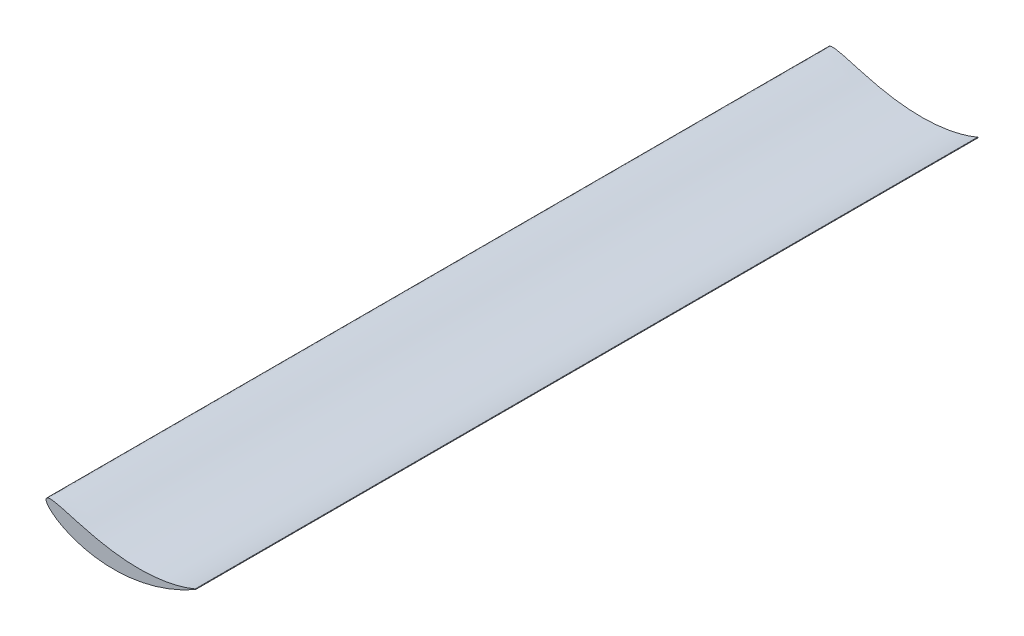
ISO-10303-21;
HEADER;
FILE_DESCRIPTION(('STEP AP214'),'2;1');
FILE_NAME('part.step','',(''),(''),'','','');
FILE_SCHEMA(('AUTOMOTIVE_DESIGN { 1 0 10303 214 1 1 1 1 }'));
ENDSEC;
DATA;
#1=APPLICATION_CONTEXT('core data for automotive mechanical design processes');
#2=APPLICATION_PROTOCOL_DEFINITION('international standard','automotive_design',2000,#1);
#3=PRODUCT_CONTEXT('',#1,'mechanical');
#4=PRODUCT('Part','Part','',(#3));
#5=PRODUCT_RELATED_PRODUCT_CATEGORY('part','',(#4));
#6=PRODUCT_DEFINITION_FORMATION('','',#4);
#7=PRODUCT_DEFINITION_CONTEXT('part definition',#1,'design');
#8=PRODUCT_DEFINITION('design','',#6,#7);
#9=PRODUCT_DEFINITION_SHAPE('','',#8);
#10=(LENGTH_UNIT() NAMED_UNIT(*) SI_UNIT(.MILLI.,.METRE.));
#11=(NAMED_UNIT(*) PLANE_ANGLE_UNIT() SI_UNIT($,.RADIAN.));
#12=(NAMED_UNIT(*) SI_UNIT($,.STERADIAN.) SOLID_ANGLE_UNIT());
#13=UNCERTAINTY_MEASURE_WITH_UNIT(LENGTH_MEASURE(1.E-05),#10,'distance_accuracy_value','');
#14=(GEOMETRIC_REPRESENTATION_CONTEXT(3) GLOBAL_UNCERTAINTY_ASSIGNED_CONTEXT((#13)) GLOBAL_UNIT_ASSIGNED_CONTEXT((#10,
#11,#12)) REPRESENTATION_CONTEXT('',''));
#15=CARTESIAN_POINT('',(0.,0.,0.));
#16=DIRECTION('',(0.,0.,1.));
#17=DIRECTION('',(1.,0.,0.));
#18=AXIS2_PLACEMENT_3D('',#15,#16,#17);
#19=CARTESIAN_POINT('',(190.956241572749,-4.7773652400738,500.));
#20=CARTESIAN_POINT('',(190.824351331435,-4.85073465637911,500.));
#21=CARTESIAN_POINT('',(189.266236246989,-5.71631154867927,500.));
#22=CARTESIAN_POINT('',(186.010858372446,-7.49360526460153,500.));
#23=CARTESIAN_POINT('',(180.823647875429,-10.2147269313576,500.));
#24=CARTESIAN_POINT('',(174.698235283672,-13.2560143177396,500.));
#25=CARTESIAN_POINT('',(167.59135908908,-16.5395762823449,500.));
#26=CARTESIAN_POINT('',(159.48834975273,-19.9547276540953,500.));
#27=CARTESIAN_POINT('',(150.393963734915,-23.3650509430077,500.));
#28=CARTESIAN_POINT('',(140.348546412923,-26.6128977934457,500.));
#29=CARTESIAN_POINT('',(129.433550223174,-29.5248982498167,500.));
#30=CARTESIAN_POINT('',(117.779572076668,-31.9239998784419,500.));
#31=CARTESIAN_POINT('',(105.569465285836,-33.648313549697,500.));
#32=CARTESIAN_POINT('',(93.0340059448322,-34.5635604701211,500.));
#33=CARTESIAN_POINT('',(80.4426492143391,-34.5850966651918,500.));
#34=CARTESIAN_POINT('',(68.0856866427688,-33.6870014790861,500.));
#35=CARTESIAN_POINT('',(56.2532972721014,-31.9099389515743,500.));
#36=CARTESIAN_POINT('',(45.2122676293166,-29.3578213920277,500.));
#37=CARTESIAN_POINT('',(35.1865501798599,-26.1864686157695,500.));
#38=CARTESIAN_POINT('',(26.3435491944197,-22.5854032327318,500.));
#39=CARTESIAN_POINT('',(18.78766503966,-18.7593018238579,500.));
#40=CARTESIAN_POINT('',(12.5632967155241,-14.9069364714745,500.));
#41=CARTESIAN_POINT('',(7.66020675550264,-11.2052846726491,500.));
#42=CARTESIAN_POINT('',(4.02760427497412,-7.8032487843966,500.));
#43=CARTESIAN_POINT('',(1.57365300949457,-4.79629138390064,500.));
#44=CARTESIAN_POINT('',(0.201464861565747,-2.25266289924747,500.));
#45=CARTESIAN_POINT('',(-0.21347160418932,-0.0689899999356164,500.));
#46=CARTESIAN_POINT('',(0.597068392516821,1.67497748421285,500.));
#47=CARTESIAN_POINT('',(2.3572122834409,2.58171887971936,500.));
#48=CARTESIAN_POINT('',(4.67296200232916,2.91910757200338,500.));
#49=CARTESIAN_POINT('',(7.60211655207605,2.83089667814873,500.));
#50=CARTESIAN_POINT('',(11.0991655086455,2.3531256256347,500.));
#51=CARTESIAN_POINT('',(15.1231444610723,1.53898804204561,500.));
#52=CARTESIAN_POINT('',(19.62268108885,0.440148355950823,500.));
#53=CARTESIAN_POINT('',(24.5519108282923,-0.886957346281386,500.));
#54=CARTESIAN_POINT('',(29.8679079946093,-2.38631354466659,500.));
#55=CARTESIAN_POINT('',(35.5308012730812,-4.00395214540364,500.));
#56=CARTESIAN_POINT('',(41.5033811180277,-5.68788873006616,500.));
#57=CARTESIAN_POINT('',(47.7502444833533,-7.38908141809133,500.));
#58=CARTESIAN_POINT('',(54.2367198881838,-9.06393435203337,500.));
#59=CARTESIAN_POINT('',(60.9292278258349,-10.6713318543495,500.));
#60=CARTESIAN_POINT('',(67.7943227961277,-12.1754460365013,500.));
#61=CARTESIAN_POINT('',(74.7986122859653,-13.5446925307062,500.));
#62=CARTESIAN_POINT('',(81.9087400099977,-14.751698968136,500.));
#63=CARTESIAN_POINT('',(89.0909511374897,-15.7746996543962,500.));
#64=CARTESIAN_POINT('',(96.3114483948899,-16.5950320077416,500.));
#65=CARTESIAN_POINT('',(103.536162889798,-17.1998293144592,500.));
#66=CARTESIAN_POINT('',(110.730986166223,-17.580161629818,500.));
#67=CARTESIAN_POINT('',(117.861845411539,-17.731640772723,500.));
#68=CARTESIAN_POINT('',(124.894874309783,-17.6543258949296,500.));
#69=CARTESIAN_POINT('',(131.796397968462,-17.3523205741085,500.));
#70=CARTESIAN_POINT('',(138.533291684862,-16.8343407675229,500.));
#71=CARTESIAN_POINT('',(145.072823386818,-16.1129291514206,500.));
#72=CARTESIAN_POINT('',(151.38319489256,-15.2048583413816,500.));
#73=CARTESIAN_POINT('',(157.433178918403,-14.1299771308705,500.));
#74=CARTESIAN_POINT('',(163.192716512034,-12.9123836369806,500.));
#75=CARTESIAN_POINT('',(168.632500234805,-11.5794794515556,500.));
#76=CARTESIAN_POINT('',(173.724620383399,-10.1623727858618,500.));
#77=CARTESIAN_POINT('',(178.441318244862,-8.69364484056416,500.));
#78=CARTESIAN_POINT('',(182.756848014337,-7.2104631039453,500.));
#79=CARTESIAN_POINT('',(186.644466439914,-5.75148715329897,500.));
#80=CARTESIAN_POINT('',(189.214186248281,-4.70836193749516,500.));
#81=CARTESIAN_POINT('',(190.487686372643,-4.16975501770226,500.));
#82=CARTESIAN_POINT('',(190.619976474965,-4.11356392201522,500.));
#83=B_SPLINE_CURVE_WITH_KNOTS('',3,(#19,#20,#21,#22,#23,#24,#25,#26,#27,#28,#29,#30,#31,#32,#33,
#34,#35,#36,#37,#38,#39,#40,#41,#42,#43,#44,#45,#46,#47,#48,#49,#50,#51,#52,#53,#54,#55,#56,#57,
#58,#59,#60,#61,#62,#63,#64,#65,#66,#67,#68,#69,#70,#71,#72,#73,#74,#75,#76,#77,#78,#79,#80,#81,
#82),.UNSPECIFIED.,.F.,.F.,(4,1,1,1,1,1,1,1,1,1,1,1,1,1,1,1,1,1,1,1,1,1,1,1,1,1,1,1,1,1,1,1,1,1,
1,1,1,1,1,1,1,1,1,1,1,1,1,1,1,1,1,1,1,1,1,1,1,1,1,1,1,4),(0.0245276990923007,0.0255892091094669,
0.037067816404931,0.0508545016176155,0.0669850232537373,0.0854578364560865,0.106225288239911,
0.12917998384715,0.154148680118291,0.180883335079671,0.209058051835446,0.238271881003164,
0.268058237582787,0.297903876235442,0.327269841048481,0.355623841618484,0.382465396579952,
0.407355501459855,0.429934859408064,0.44993897241164,0.467201510337176,0.481654743678724,
0.493326475768122,0.502345383546677,0.508967218144621,0.513683958526164,0.517466280768162,
0.521650737101246,0.527066359245362,0.533951818546579,0.542299609164813,0.552017630625205,
0.562981800758078,0.575062674605368,0.58812908832469,0.602056581828096,0.616727009192038,
0.632028813514711,0.647858179931905,0.664118458358625,0.680718253960307,0.697573163857051,
0.714603084498674,0.731732437979172,0.748889668859815,0.766005494621813,0.783014284870449,
0.799851871116559,0.816455186450603,0.832763308706103,0.848714237871263,0.864246916691086,
0.879299021901587,0.893808281163375,0.907709696319397,0.920937866660647,0.933423618359619,
0.945096561860754,0.955881368680516,0.965700785345497,0.974472497589234,0.975490116606881),.UNSPECIFIED.);
#84=DIRECTION('',(0.,0.,-1.));
#85=VECTOR('',#84,1.);
#86=SURFACE_OF_LINEAR_EXTRUSION('',#83,#85);
#87=CARTESIAN_POINT('',(190.956241572749,-4.7773652400738,-500.));
#88=CARTESIAN_POINT('',(190.824351331435,-4.85073465637911,-500.));
#89=CARTESIAN_POINT('',(189.266236246989,-5.71631154867927,-500.));
#90=CARTESIAN_POINT('',(186.010858372446,-7.49360526460153,-500.));
#91=CARTESIAN_POINT('',(180.823647875429,-10.2147269313576,-500.));
#92=CARTESIAN_POINT('',(174.698235283672,-13.2560143177396,-500.));
#93=CARTESIAN_POINT('',(167.59135908908,-16.5395762823449,-500.));
#94=CARTESIAN_POINT('',(159.48834975273,-19.9547276540953,-500.));
#95=CARTESIAN_POINT('',(150.393963734915,-23.3650509430077,-500.));
#96=CARTESIAN_POINT('',(140.348546412923,-26.6128977934457,-500.));
#97=CARTESIAN_POINT('',(129.433550223174,-29.5248982498167,-500.));
#98=CARTESIAN_POINT('',(117.779572076668,-31.9239998784419,-500.));
#99=CARTESIAN_POINT('',(105.569465285836,-33.648313549697,-500.));
#100=CARTESIAN_POINT('',(93.0340059448322,-34.5635604701211,-500.));
#101=CARTESIAN_POINT('',(80.4426492143391,-34.5850966651918,-500.));
#102=CARTESIAN_POINT('',(68.0856866427688,-33.6870014790861,-500.));
#103=CARTESIAN_POINT('',(56.2532972721014,-31.9099389515743,-500.));
#104=CARTESIAN_POINT('',(45.2122676293166,-29.3578213920277,-500.));
#105=CARTESIAN_POINT('',(35.1865501798599,-26.1864686157695,-500.));
#106=CARTESIAN_POINT('',(26.3435491944197,-22.5854032327318,-500.));
#107=CARTESIAN_POINT('',(18.78766503966,-18.7593018238579,-500.));
#108=CARTESIAN_POINT('',(12.5632967155241,-14.9069364714745,-500.));
#109=CARTESIAN_POINT('',(7.66020675550264,-11.2052846726491,-500.));
#110=CARTESIAN_POINT('',(4.02760427497412,-7.8032487843966,-500.));
#111=CARTESIAN_POINT('',(1.57365300949457,-4.79629138390064,-500.));
#112=CARTESIAN_POINT('',(0.201464861565747,-2.25266289924747,-500.));
#113=CARTESIAN_POINT('',(-0.21347160418932,-0.0689899999356164,-500.));
#114=CARTESIAN_POINT('',(0.597068392516821,1.67497748421285,-500.));
#115=CARTESIAN_POINT('',(2.3572122834409,2.58171887971936,-500.));
#116=CARTESIAN_POINT('',(4.67296200232916,2.91910757200338,-500.));
#117=CARTESIAN_POINT('',(7.60211655207605,2.83089667814873,-500.));
#118=CARTESIAN_POINT('',(11.0991655086455,2.3531256256347,-500.));
#119=CARTESIAN_POINT('',(15.1231444610723,1.53898804204561,-500.));
#120=CARTESIAN_POINT('',(19.62268108885,0.440148355950823,-500.));
#121=CARTESIAN_POINT('',(24.5519108282923,-0.886957346281386,-500.));
#122=CARTESIAN_POINT('',(29.8679079946093,-2.38631354466659,-500.));
#123=CARTESIAN_POINT('',(35.5308012730812,-4.00395214540364,-500.));
#124=CARTESIAN_POINT('',(41.5033811180277,-5.68788873006616,-500.));
#125=CARTESIAN_POINT('',(47.7502444833533,-7.38908141809133,-500.));
#126=CARTESIAN_POINT('',(54.2367198881838,-9.06393435203337,-500.));
#127=CARTESIAN_POINT('',(60.9292278258349,-10.6713318543495,-500.));
#128=CARTESIAN_POINT('',(67.7943227961277,-12.1754460365013,-500.));
#129=CARTESIAN_POINT('',(74.7986122859653,-13.5446925307062,-500.));
#130=CARTESIAN_POINT('',(81.9087400099977,-14.751698968136,-500.));
#131=CARTESIAN_POINT('',(89.0909511374897,-15.7746996543962,-500.));
#132=CARTESIAN_POINT('',(96.3114483948899,-16.5950320077416,-500.));
#133=CARTESIAN_POINT('',(103.536162889798,-17.1998293144592,-500.));
#134=CARTESIAN_POINT('',(110.730986166223,-17.580161629818,-500.));
#135=CARTESIAN_POINT('',(117.861845411539,-17.731640772723,-500.));
#136=CARTESIAN_POINT('',(124.894874309783,-17.6543258949296,-500.));
#137=CARTESIAN_POINT('',(131.796397968462,-17.3523205741085,-500.));
#138=CARTESIAN_POINT('',(138.533291684862,-16.8343407675229,-500.));
#139=CARTESIAN_POINT('',(145.072823386818,-16.1129291514206,-500.));
#140=CARTESIAN_POINT('',(151.38319489256,-15.2048583413816,-500.));
#141=CARTESIAN_POINT('',(157.433178918403,-14.1299771308705,-500.));
#142=CARTESIAN_POINT('',(163.192716512034,-12.9123836369806,-500.));
#143=CARTESIAN_POINT('',(168.632500234805,-11.5794794515556,-500.));
#144=CARTESIAN_POINT('',(173.724620383399,-10.1623727858618,-500.));
#145=CARTESIAN_POINT('',(178.441318244862,-8.69364484056416,-500.));
#146=CARTESIAN_POINT('',(182.756848014337,-7.2104631039453,-500.));
#147=CARTESIAN_POINT('',(186.644466439914,-5.75148715329897,-500.));
#148=CARTESIAN_POINT('',(189.214186248281,-4.70836193749516,-500.));
#149=CARTESIAN_POINT('',(190.487686372643,-4.16975501770226,-500.));
#150=CARTESIAN_POINT('',(190.619976474965,-4.11356392201522,-500.));
#151=B_SPLINE_CURVE_WITH_KNOTS('',3,(#87,#88,#89,#90,#91,#92,#93,#94,#95,#96,#97,#98,#99,#100,
#101,#102,#103,#104,#105,#106,#107,#108,#109,#110,#111,#112,#113,#114,#115,#116,#117,#118,#119,
#120,#121,#122,#123,#124,#125,#126,#127,#128,#129,#130,#131,#132,#133,#134,#135,#136,#137,#138,
#139,#140,#141,#142,#143,#144,#145,#146,#147,#148,#149,#150),.UNSPECIFIED.,.F.,.F.,(4,1,1,1,1,1,
1,1,1,1,1,1,1,1,1,1,1,1,1,1,1,1,1,1,1,1,1,1,1,1,1,1,1,1,1,1,1,1,1,1,1,1,1,1,1,1,1,1,1,1,1,1,1,1,
1,1,1,1,1,1,1,4),(0.0245276990923007,0.0255892091094669,0.037067816404931,0.0508545016176155,
0.0669850232537373,0.0854578364560865,0.106225288239911,0.12917998384715,0.154148680118291,
0.180883335079671,0.209058051835446,0.238271881003164,0.268058237582787,0.297903876235442,
0.327269841048481,0.355623841618484,0.382465396579952,0.407355501459855,0.429934859408064,
0.44993897241164,0.467201510337176,0.481654743678724,0.493326475768122,0.502345383546677,
0.508967218144621,0.513683958526164,0.517466280768162,0.521650737101246,0.527066359245362,
0.533951818546579,0.542299609164813,0.552017630625205,0.562981800758078,0.575062674605368,
0.58812908832469,0.602056581828096,0.616727009192038,0.632028813514711,0.647858179931905,
0.664118458358625,0.680718253960307,0.697573163857051,0.714603084498674,0.731732437979172,
0.748889668859815,0.766005494621813,0.783014284870449,0.799851871116559,0.816455186450603,
0.832763308706103,0.848714237871263,0.864246916691086,0.879299021901587,0.893808281163375,
0.907709696319397,0.920937866660647,0.933423618359619,0.945096561860754,0.955881368680516,
0.965700785345497,0.974472497589234,0.975490116606881),.UNSPECIFIED.);
#152=CARTESIAN_POINT('',(190.956241572764,-4.77736524010311,-500.));
#153=VERTEX_POINT('',#152);
#154=CARTESIAN_POINT('',(190.61997647498,-4.11356392204451,-500.));
#155=VERTEX_POINT('',#154);
#156=EDGE_CURVE('E62',#153,#155,#151,.T.);
#157=ORIENTED_EDGE('',*,*,#156,.F.);
#158=DIRECTION('',(0.,0.,-1.));
#159=VECTOR('',#158,1.);
#160=CARTESIAN_POINT('',(190.956241572764,-4.77736524010311,500.));
#161=LINE('',#160,#159);
#162=CARTESIAN_POINT('',(190.956241572764,-4.77736524010311,500.));
#163=VERTEX_POINT('',#162);
#164=EDGE_CURVE('E11',#163,#153,#161,.T.);
#165=ORIENTED_EDGE('',*,*,#164,.F.);
#166=CARTESIAN_POINT('',(190.61997647498,-4.11356392204451,500.));
#167=VERTEX_POINT('',#166);
#168=EDGE_CURVE('E66',#163,#167,#83,.T.);
#169=ORIENTED_EDGE('',*,*,#168,.T.);
#170=DIRECTION('',(0.,0.,-1.));
#171=VECTOR('',#170,1.);
#172=CARTESIAN_POINT('',(190.61997647498,-4.11356392204451,500.));
#173=LINE('',#172,#171);
#174=EDGE_CURVE('E36',#167,#155,#173,.T.);
#175=ORIENTED_EDGE('',*,*,#174,.T.);
#176=EDGE_LOOP('',(#157,#165,#169,#175));
#177=FACE_BOUND('',#176,.T.);
#178=ADVANCED_FACE('F32',(#177),#86,.T.);
#179=CARTESIAN_POINT('',(190.788109023117,-4.44546458145649,500.));
#180=DIRECTION('',(0.,0.,-1.));
#181=DIRECTION('',(-1.,0.,0.));
#182=AXIS2_PLACEMENT_3D('',#179,#180,#181);
#183=CYLINDRICAL_SURFACE('',#182,0.372057255621991);
#184=CARTESIAN_POINT('',(190.788109023117,-4.44546458145649,-500.));
#185=DIRECTION('',(0.,0.,-1.));
#186=DIRECTION('',(-1.,0.,0.));
#187=AXIS2_PLACEMENT_3D('',#184,#185,#186);
#188=CIRCLE('',#187,0.372057255621991);
#189=EDGE_CURVE('E59',#155,#153,#188,.T.);
#190=ORIENTED_EDGE('',*,*,#189,.F.);
#191=ORIENTED_EDGE('',*,*,#174,.F.);
#192=CARTESIAN_POINT('',(190.788109023117,-4.44546458145649,500.));
#193=DIRECTION('',(0.,0.,-1.));
#194=DIRECTION('',(-1.,0.,0.));
#195=AXIS2_PLACEMENT_3D('',#192,#193,#194);
#196=CIRCLE('',#195,0.372057255621991);
#197=EDGE_CURVE('E61',#167,#163,#196,.T.);
#198=ORIENTED_EDGE('',*,*,#197,.T.);
#199=ORIENTED_EDGE('',*,*,#164,.T.);
#200=EDGE_LOOP('',(#190,#191,#198,#199));
#201=FACE_BOUND('',#200,.T.);
#202=ADVANCED_FACE('F57',(#201),#183,.T.);
#203=CARTESIAN_POINT('',(2.03645949512922,-5.27175743439099,500.));
#204=DIRECTION('',(0.,0.,1.));
#205=DIRECTION('',(1.,0.,0.));
#206=AXIS2_PLACEMENT_3D('',#203,#204,#205);
#207=PLANE('',#206);
#208=ORIENTED_EDGE('',*,*,#168,.F.);
#209=ORIENTED_EDGE('',*,*,#197,.F.);
#210=EDGE_LOOP('',(#208,#209));
#211=FACE_BOUND('',#210,.T.);
#212=ADVANCED_FACE('F81',(#211),#207,.T.);
#213=CARTESIAN_POINT('',(2.03645949512922,-5.27175743439099,-500.));
#214=DIRECTION('',(0.,0.,1.));
#215=DIRECTION('',(1.,0.,0.));
#216=AXIS2_PLACEMENT_3D('',#213,#214,#215);
#217=PLANE('',#216);
#218=ORIENTED_EDGE('',*,*,#156,.T.);
#219=ORIENTED_EDGE('',*,*,#189,.T.);
#220=EDGE_LOOP('',(#218,#219));
#221=FACE_BOUND('',#220,.T.);
#222=ADVANCED_FACE('F65',(#221),#217,.F.);
#223=CLOSED_SHELL('',(#178,#202,#212,#222));
#224=MANIFOLD_SOLID_BREP('B2',#223);
#225=ADVANCED_BREP_SHAPE_REPRESENTATION('',(#18,#224),#14);
#226=SHAPE_DEFINITION_REPRESENTATION(#9,#225);
ENDSEC;
END-ISO-10303-21;
